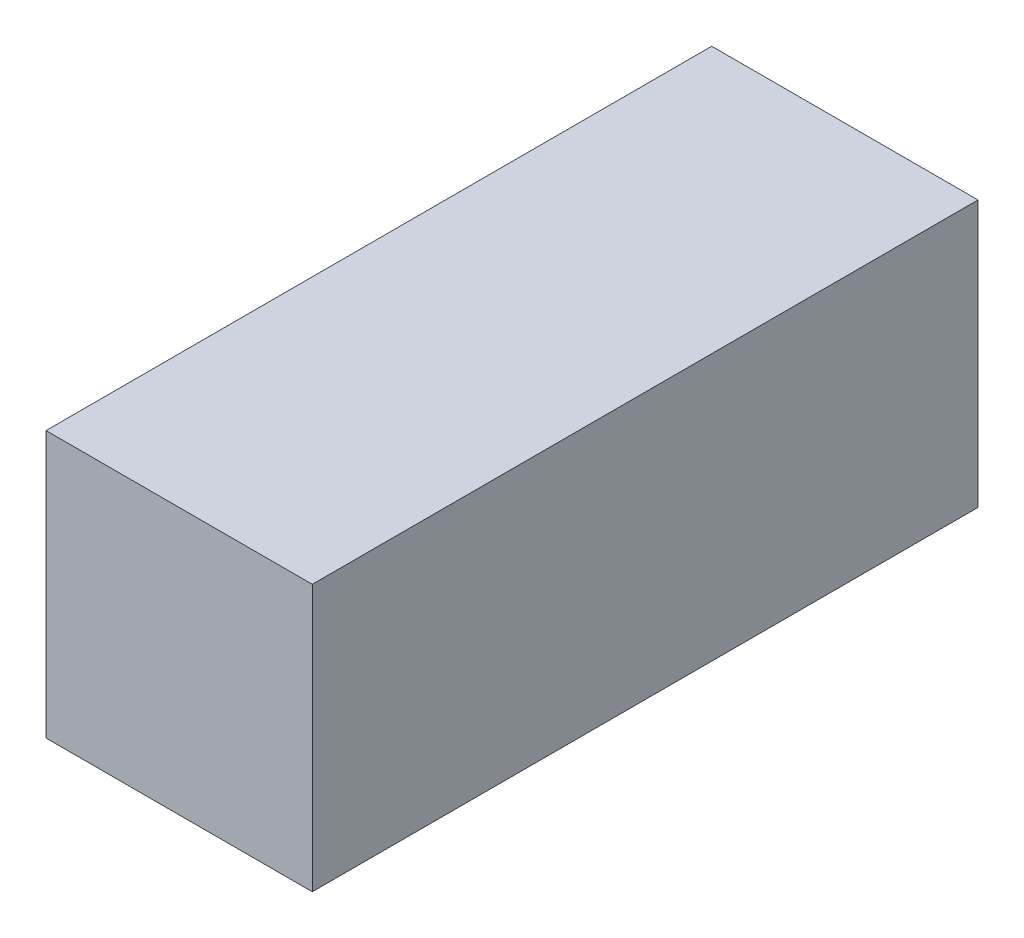
ISO-10303-21;
HEADER;
FILE_DESCRIPTION(('STEP AP214'),'2;1');
FILE_NAME('part.step','',(''),(''),'','','');
FILE_SCHEMA(('AUTOMOTIVE_DESIGN { 1 0 10303 214 1 1 1 1 }'));
ENDSEC;
DATA;
#1=APPLICATION_CONTEXT('core data for automotive mechanical design processes');
#2=APPLICATION_PROTOCOL_DEFINITION('international standard','automotive_design',2000,#1);
#3=PRODUCT_CONTEXT('',#1,'mechanical');
#4=PRODUCT('Part','Part','',(#3));
#5=PRODUCT_RELATED_PRODUCT_CATEGORY('part','',(#4));
#6=PRODUCT_DEFINITION_FORMATION('','',#4);
#7=PRODUCT_DEFINITION_CONTEXT('part definition',#1,'design');
#8=PRODUCT_DEFINITION('design','',#6,#7);
#9=PRODUCT_DEFINITION_SHAPE('','',#8);
#10=(LENGTH_UNIT() NAMED_UNIT(*) SI_UNIT(.MILLI.,.METRE.));
#11=(NAMED_UNIT(*) PLANE_ANGLE_UNIT() SI_UNIT($,.RADIAN.));
#12=(NAMED_UNIT(*) SI_UNIT($,.STERADIAN.) SOLID_ANGLE_UNIT());
#13=UNCERTAINTY_MEASURE_WITH_UNIT(LENGTH_MEASURE(1.E-05),#10,'distance_accuracy_value','');
#14=(GEOMETRIC_REPRESENTATION_CONTEXT(3) GLOBAL_UNCERTAINTY_ASSIGNED_CONTEXT((#13)) GLOBAL_UNIT_ASSIGNED_CONTEXT((#10,
#11,#12)) REPRESENTATION_CONTEXT('',''));
#15=CARTESIAN_POINT('',(0.,0.,0.));
#16=DIRECTION('',(0.,0.,1.));
#17=DIRECTION('',(1.,0.,0.));
#18=AXIS2_PLACEMENT_3D('',#15,#16,#17);
#19=CARTESIAN_POINT('',(-21.840490797546,23.4665855391729,100.));
#20=DIRECTION('',(0.,-1.,0.));
#21=DIRECTION('',(0.,0.,-1.));
#22=AXIS2_PLACEMENT_3D('',#19,#20,#21);
#23=PLANE('',#22);
#24=DIRECTION('',(-1.,0.,0.));
#25=VECTOR('',#24,1.);
#26=CARTESIAN_POINT('',(-21.840490797546,23.4665855391729,0.));
#27=LINE('',#26,#25);
#28=CARTESIAN_POINT('',(18.159509202454,23.4665855391729,0.));
#29=VERTEX_POINT('',#28);
#30=CARTESIAN_POINT('',(-21.840490797546,23.4665855391729,0.));
#31=VERTEX_POINT('',#30);
#32=EDGE_CURVE('E107',#29,#31,#27,.T.);
#33=ORIENTED_EDGE('',*,*,#32,.T.);
#34=DIRECTION('',(0.,0.,-1.));
#35=VECTOR('',#34,1.);
#36=CARTESIAN_POINT('',(-21.840490797546,23.4665855391729,100.));
#37=LINE('',#36,#35);
#38=CARTESIAN_POINT('',(-21.840490797546,23.4665855391729,100.));
#39=VERTEX_POINT('',#38);
#40=EDGE_CURVE('E11',#39,#31,#37,.T.);
#41=ORIENTED_EDGE('',*,*,#40,.F.);
#42=DIRECTION('',(-1.,0.,0.));
#43=VECTOR('',#42,1.);
#44=CARTESIAN_POINT('',(-21.840490797546,23.4665855391729,100.));
#45=LINE('',#44,#43);
#46=CARTESIAN_POINT('',(18.159509202454,23.4665855391729,100.));
#47=VERTEX_POINT('',#46);
#48=EDGE_CURVE('E91',#47,#39,#45,.T.);
#49=ORIENTED_EDGE('',*,*,#48,.F.);
#50=DIRECTION('',(0.,0.,-1.));
#51=VECTOR('',#50,1.);
#52=CARTESIAN_POINT('',(18.159509202454,23.4665855391729,100.));
#53=LINE('',#52,#51);
#54=EDGE_CURVE('E103',#47,#29,#53,.T.);
#55=ORIENTED_EDGE('',*,*,#54,.T.);
#56=EDGE_LOOP('',(#33,#41,#49,#55));
#57=FACE_BOUND('',#56,.T.);
#58=ADVANCED_FACE('F39',(#57),#23,.F.);
#59=CARTESIAN_POINT('',(-21.840490797546,23.4665855391729,100.));
#60=DIRECTION('',(1.,0.,0.));
#61=DIRECTION('',(0.,0.,-1.));
#62=AXIS2_PLACEMENT_3D('',#59,#60,#61);
#63=PLANE('',#62);
#64=DIRECTION('',(0.,-1.,0.));
#65=VECTOR('',#64,1.);
#66=CARTESIAN_POINT('',(-21.840490797546,23.4665855391729,0.));
#67=LINE('',#66,#65);
#68=CARTESIAN_POINT('',(-21.840490797546,-16.5334144608271,0.));
#69=VERTEX_POINT('',#68);
#70=EDGE_CURVE('E96',#31,#69,#67,.T.);
#71=ORIENTED_EDGE('',*,*,#70,.T.);
#72=DIRECTION('',(0.,0.,-1.));
#73=VECTOR('',#72,1.);
#74=CARTESIAN_POINT('',(-21.840490797546,-16.5334144608271,100.));
#75=LINE('',#74,#73);
#76=CARTESIAN_POINT('',(-21.840490797546,-16.5334144608271,100.));
#77=VERTEX_POINT('',#76);
#78=EDGE_CURVE('E48',#77,#69,#75,.T.);
#79=ORIENTED_EDGE('',*,*,#78,.F.);
#80=DIRECTION('',(0.,-1.,0.));
#81=VECTOR('',#80,1.);
#82=CARTESIAN_POINT('',(-21.840490797546,23.4665855391729,100.));
#83=LINE('',#82,#81);
#84=EDGE_CURVE('E86',#39,#77,#83,.T.);
#85=ORIENTED_EDGE('',*,*,#84,.F.);
#86=ORIENTED_EDGE('',*,*,#40,.T.);
#87=EDGE_LOOP('',(#71,#79,#85,#86));
#88=FACE_BOUND('',#87,.T.);
#89=ADVANCED_FACE('F95',(#88),#63,.F.);
#90=CARTESIAN_POINT('',(18.159509202454,-16.5334144608271,100.));
#91=DIRECTION('',(0.,1.,0.));
#92=DIRECTION('',(-1.,0.,0.));
#93=AXIS2_PLACEMENT_3D('',#90,#91,#92);
#94=PLANE('',#93);
#95=DIRECTION('',(1.,0.,0.));
#96=VECTOR('',#95,1.);
#97=CARTESIAN_POINT('',(18.159509202454,-16.5334144608271,0.));
#98=LINE('',#97,#96);
#99=CARTESIAN_POINT('',(18.159509202454,-16.5334144608271,0.));
#100=VERTEX_POINT('',#99);
#101=EDGE_CURVE('E73',#69,#100,#98,.T.);
#102=ORIENTED_EDGE('',*,*,#101,.T.);
#103=DIRECTION('',(0.,0.,-1.));
#104=VECTOR('',#103,1.);
#105=CARTESIAN_POINT('',(18.159509202454,-16.5334144608271,100.));
#106=LINE('',#105,#104);
#107=CARTESIAN_POINT('',(18.159509202454,-16.5334144608271,100.));
#108=VERTEX_POINT('',#107);
#109=EDGE_CURVE('E98',#108,#100,#106,.T.);
#110=ORIENTED_EDGE('',*,*,#109,.F.);
#111=DIRECTION('',(1.,0.,0.));
#112=VECTOR('',#111,1.);
#113=CARTESIAN_POINT('',(18.159509202454,-16.5334144608271,100.));
#114=LINE('',#113,#112);
#115=EDGE_CURVE('E89',#77,#108,#114,.T.);
#116=ORIENTED_EDGE('',*,*,#115,.F.);
#117=ORIENTED_EDGE('',*,*,#78,.T.);
#118=EDGE_LOOP('',(#102,#110,#116,#117));
#119=FACE_BOUND('',#118,.T.);
#120=ADVANCED_FACE('F99',(#119),#94,.F.);
#121=CARTESIAN_POINT('',(18.159509202454,23.4665855391729,100.));
#122=DIRECTION('',(-1.,0.,0.));
#123=DIRECTION('',(0.,-1.,0.));
#124=AXIS2_PLACEMENT_3D('',#121,#122,#123);
#125=PLANE('',#124);
#126=DIRECTION('',(0.,1.,0.));
#127=VECTOR('',#126,1.);
#128=CARTESIAN_POINT('',(18.159509202454,23.4665855391729,0.));
#129=LINE('',#128,#127);
#130=EDGE_CURVE('E79',#100,#29,#129,.T.);
#131=ORIENTED_EDGE('',*,*,#130,.T.);
#132=ORIENTED_EDGE('',*,*,#54,.F.);
#133=DIRECTION('',(0.,1.,0.));
#134=VECTOR('',#133,1.);
#135=CARTESIAN_POINT('',(18.159509202454,23.4665855391729,100.));
#136=LINE('',#135,#134);
#137=EDGE_CURVE('E56',#108,#47,#136,.T.);
#138=ORIENTED_EDGE('',*,*,#137,.F.);
#139=ORIENTED_EDGE('',*,*,#109,.T.);
#140=EDGE_LOOP('',(#131,#132,#138,#139));
#141=FACE_BOUND('',#140,.T.);
#142=ADVANCED_FACE('F120',(#141),#125,.F.);
#143=CARTESIAN_POINT('',(0.,0.,100.));
#144=DIRECTION('',(0.,0.,-1.));
#145=DIRECTION('',(-1.,0.,0.));
#146=AXIS2_PLACEMENT_3D('',#143,#144,#145);
#147=PLANE('',#146);
#148=ORIENTED_EDGE('',*,*,#48,.T.);
#149=ORIENTED_EDGE('',*,*,#84,.T.);
#150=ORIENTED_EDGE('',*,*,#115,.T.);
#151=ORIENTED_EDGE('',*,*,#137,.T.);
#152=EDGE_LOOP('',(#148,#149,#150,#151));
#153=FACE_BOUND('',#152,.T.);
#154=ADVANCED_FACE('F87',(#153),#147,.F.);
#155=CARTESIAN_POINT('',(0.,0.,0.));
#156=DIRECTION('',(0.,0.,-1.));
#157=DIRECTION('',(-1.,0.,0.));
#158=AXIS2_PLACEMENT_3D('',#155,#156,#157);
#159=PLANE('',#158);
#160=ORIENTED_EDGE('',*,*,#32,.F.);
#161=ORIENTED_EDGE('',*,*,#130,.F.);
#162=ORIENTED_EDGE('',*,*,#101,.F.);
#163=ORIENTED_EDGE('',*,*,#70,.F.);
#164=EDGE_LOOP('',(#160,#161,#162,#163));
#165=FACE_BOUND('',#164,.T.);
#166=ADVANCED_FACE('F123',(#165),#159,.T.);
#167=CLOSED_SHELL('',(#58,#89,#120,#142,#154,#166));
#168=MANIFOLD_SOLID_BREP('B2',#167);
#169=ADVANCED_BREP_SHAPE_REPRESENTATION('',(#18,#168),#14);
#170=SHAPE_DEFINITION_REPRESENTATION(#9,#169);
ENDSEC;
END-ISO-10303-21;
